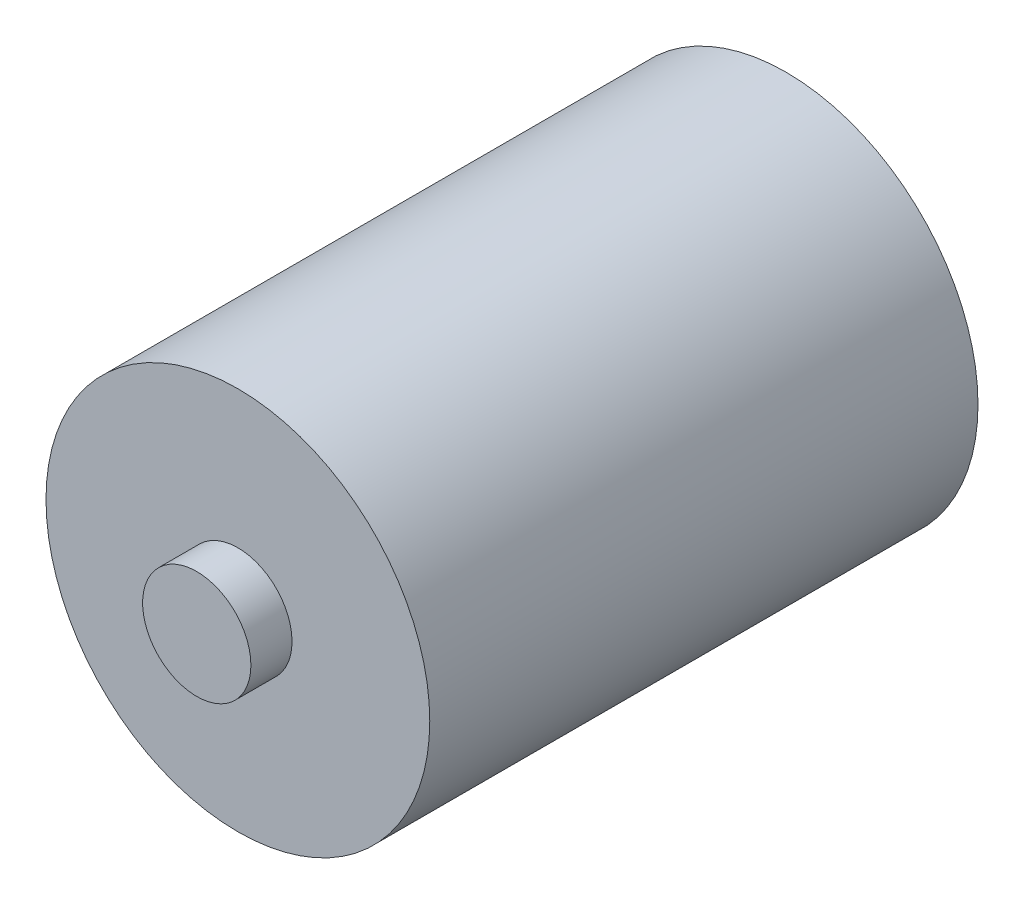
ISO-10303-21;
HEADER;
FILE_DESCRIPTION(('STEP AP214'),'2;1');
FILE_NAME('part.step','',(''),(''),'','','');
FILE_SCHEMA(('AUTOMOTIVE_DESIGN { 1 0 10303 214 1 1 1 1 }'));
ENDSEC;
DATA;
#1=APPLICATION_CONTEXT('core data for automotive mechanical design processes');
#2=APPLICATION_PROTOCOL_DEFINITION('international standard','automotive_design',2000,#1);
#3=PRODUCT_CONTEXT('',#1,'mechanical');
#4=PRODUCT('Part','Part','',(#3));
#5=PRODUCT_RELATED_PRODUCT_CATEGORY('part','',(#4));
#6=PRODUCT_DEFINITION_FORMATION('','',#4);
#7=PRODUCT_DEFINITION_CONTEXT('part definition',#1,'design');
#8=PRODUCT_DEFINITION('design','',#6,#7);
#9=PRODUCT_DEFINITION_SHAPE('','',#8);
#10=(LENGTH_UNIT() NAMED_UNIT(*) SI_UNIT(.MILLI.,.METRE.));
#11=(NAMED_UNIT(*) PLANE_ANGLE_UNIT() SI_UNIT($,.RADIAN.));
#12=(NAMED_UNIT(*) SI_UNIT($,.STERADIAN.) SOLID_ANGLE_UNIT());
#13=UNCERTAINTY_MEASURE_WITH_UNIT(LENGTH_MEASURE(1.E-05),#10,'distance_accuracy_value','');
#14=(GEOMETRIC_REPRESENTATION_CONTEXT(3) GLOBAL_UNCERTAINTY_ASSIGNED_CONTEXT((#13)) GLOBAL_UNIT_ASSIGNED_CONTEXT((#10,
#11,#12)) REPRESENTATION_CONTEXT('',''));
#15=CARTESIAN_POINT('',(0.,0.,0.));
#16=DIRECTION('',(0.,0.,1.));
#17=DIRECTION('',(1.,0.,0.));
#18=AXIS2_PLACEMENT_3D('',#15,#16,#17);
#19=CARTESIAN_POINT('',(0.,0.,-7.));
#20=DIRECTION('',(0.,0.,-1.));
#21=DIRECTION('',(-1.,0.,0.));
#22=AXIS2_PLACEMENT_3D('',#19,#20,#21);
#23=PLANE('',#22);
#24=CARTESIAN_POINT('',(-8.33710130089571,8.58016845602094,-7.));
#25=DIRECTION('',(0.,0.,-1.));
#26=DIRECTION('',(-1.,0.,0.));
#27=AXIS2_PLACEMENT_3D('',#24,#25,#26);
#28=CIRCLE('',#27,13.0059453973171);
#29=CARTESIAN_POINT('',(-21.3430466982128,8.58016845602094,-7.));
#30=VERTEX_POINT('',#29);
#31=EDGE_CURVE('E58',#30,#30,#28,.T.);
#32=ORIENTED_EDGE('',*,*,#31,.F.);
#33=EDGE_LOOP('',(#32));
#34=FACE_BOUND('',#33,.T.);
#35=CARTESIAN_POINT('',(0.,0.,-7.));
#36=DIRECTION('',(0.,0.,-1.));
#37=DIRECTION('',(-1.,0.,0.));
#38=AXIS2_PLACEMENT_3D('',#35,#36,#37);
#39=CIRCLE('',#38,31.5);
#40=CARTESIAN_POINT('',(-31.5,0.,-7.));
#41=VERTEX_POINT('',#40);
#42=EDGE_CURVE('E52',#41,#41,#39,.T.);
#43=ORIENTED_EDGE('',*,*,#42,.T.);
#44=EDGE_LOOP('',(#43));
#45=FACE_BOUND('',#44,.T.);
#46=CARTESIAN_POINT('',(13.6579561272328,-10.6157126716084,-7.));
#47=DIRECTION('',(0.,0.,-1.));
#48=DIRECTION('',(-1.,0.,0.));
#49=AXIS2_PLACEMENT_3D('',#46,#47,#48);
#50=CIRCLE('',#49,5.91310346280732);
#51=CARTESIAN_POINT('',(7.74485266442543,-10.6157126716084,-7.));
#52=VERTEX_POINT('',#51);
#53=EDGE_CURVE('E64',#52,#52,#50,.T.);
#54=ORIENTED_EDGE('',*,*,#53,.F.);
#55=EDGE_LOOP('',(#54));
#56=FACE_BOUND('',#55,.T.);
#57=ADVANCED_FACE('F31',(#34,#45,#56),#23,.T.);
#58=CARTESIAN_POINT('',(0.,0.,0.));
#59=DIRECTION('',(0.,0.,1.));
#60=DIRECTION('',(1.,0.,0.));
#61=AXIS2_PLACEMENT_3D('',#58,#59,#60);
#62=PLANE('',#61);
#63=CARTESIAN_POINT('',(0.,0.,0.));
#64=DIRECTION('',(0.,0.,1.));
#65=DIRECTION('',(1.,0.,0.));
#66=AXIS2_PLACEMENT_3D('',#63,#64,#65);
#67=CIRCLE('',#66,70.);
#68=CARTESIAN_POINT('',(70.,0.,0.));
#69=VERTEX_POINT('',#68);
#70=EDGE_CURVE('E42',#69,#69,#67,.T.);
#71=ORIENTED_EDGE('',*,*,#70,.F.);
#72=EDGE_LOOP('',(#71));
#73=FACE_BOUND('',#72,.T.);
#74=CARTESIAN_POINT('',(0.,0.,0.));
#75=DIRECTION('',(0.,0.,1.));
#76=DIRECTION('',(1.,0.,0.));
#77=AXIS2_PLACEMENT_3D('',#74,#75,#76);
#78=CIRCLE('',#77,31.5);
#79=CARTESIAN_POINT('',(31.5,0.,0.));
#80=VERTEX_POINT('',#79);
#81=EDGE_CURVE('E10',#80,#80,#78,.F.);
#82=ORIENTED_EDGE('',*,*,#81,.F.);
#83=EDGE_LOOP('',(#82));
#84=FACE_BOUND('',#83,.T.);
#85=ADVANCED_FACE('F80',(#73,#84),#62,.F.);
#86=CARTESIAN_POINT('',(0.,0.,200.));
#87=DIRECTION('',(0.,0.,1.));
#88=DIRECTION('',(1.,0.,0.));
#89=AXIS2_PLACEMENT_3D('',#86,#87,#88);
#90=PLANE('',#89);
#91=CARTESIAN_POINT('',(0.,0.,200.));
#92=DIRECTION('',(0.,0.,1.));
#93=DIRECTION('',(1.,0.,0.));
#94=AXIS2_PLACEMENT_3D('',#91,#92,#93);
#95=CIRCLE('',#94,70.);
#96=CARTESIAN_POINT('',(70.,0.,200.));
#97=VERTEX_POINT('',#96);
#98=EDGE_CURVE('E38',#97,#97,#95,.T.);
#99=ORIENTED_EDGE('',*,*,#98,.T.);
#100=EDGE_LOOP('',(#99));
#101=FACE_BOUND('',#100,.T.);
#102=CARTESIAN_POINT('',(0.,0.,200.));
#103=DIRECTION('',(0.,0.,1.));
#104=DIRECTION('',(1.,0.,0.));
#105=AXIS2_PLACEMENT_3D('',#102,#103,#104);
#106=CIRCLE('',#105,19.75);
#107=CARTESIAN_POINT('',(19.75,0.,200.));
#108=VERTEX_POINT('',#107);
#109=EDGE_CURVE('E49',#108,#108,#106,.T.);
#110=ORIENTED_EDGE('',*,*,#109,.F.);
#111=EDGE_LOOP('',(#110));
#112=FACE_BOUND('',#111,.T.);
#113=ADVANCED_FACE('F86',(#101,#112),#90,.T.);
#114=CARTESIAN_POINT('',(0.,0.,200.));
#115=DIRECTION('',(0.,0.,-1.));
#116=DIRECTION('',(-1.,0.,0.));
#117=AXIS2_PLACEMENT_3D('',#114,#115,#116);
#118=CYLINDRICAL_SURFACE('',#117,70.);
#119=ORIENTED_EDGE('',*,*,#98,.F.);
#120=EDGE_LOOP('',(#119));
#121=FACE_BOUND('',#120,.T.);
#122=ORIENTED_EDGE('',*,*,#70,.T.);
#123=EDGE_LOOP('',(#122));
#124=FACE_BOUND('',#123,.T.);
#125=ADVANCED_FACE('F33',(#121,#124),#118,.T.);
#126=CARTESIAN_POINT('',(0.,0.,215.));
#127=DIRECTION('',(0.,0.,-1.));
#128=DIRECTION('',(-1.,0.,0.));
#129=AXIS2_PLACEMENT_3D('',#126,#127,#128);
#130=CYLINDRICAL_SURFACE('',#129,19.75);
#131=CARTESIAN_POINT('',(0.,0.,215.));
#132=DIRECTION('',(0.,0.,1.));
#133=DIRECTION('',(1.,0.,0.));
#134=AXIS2_PLACEMENT_3D('',#131,#132,#133);
#135=CIRCLE('',#134,19.75);
#136=CARTESIAN_POINT('',(19.75,0.,215.));
#137=VERTEX_POINT('',#136);
#138=EDGE_CURVE('E47',#137,#137,#135,.T.);
#139=ORIENTED_EDGE('',*,*,#138,.F.);
#140=EDGE_LOOP('',(#139));
#141=FACE_BOUND('',#140,.T.);
#142=ORIENTED_EDGE('',*,*,#109,.T.);
#143=EDGE_LOOP('',(#142));
#144=FACE_BOUND('',#143,.T.);
#145=ADVANCED_FACE('F101',(#141,#144),#130,.T.);
#146=CARTESIAN_POINT('',(0.,0.,215.));
#147=DIRECTION('',(0.,0.,1.));
#148=DIRECTION('',(1.,0.,0.));
#149=AXIS2_PLACEMENT_3D('',#146,#147,#148);
#150=PLANE('',#149);
#151=ORIENTED_EDGE('',*,*,#138,.T.);
#152=EDGE_LOOP('',(#151));
#153=FACE_BOUND('',#152,.T.);
#154=ADVANCED_FACE('F97',(#153),#150,.T.);
#155=CARTESIAN_POINT('',(0.,0.,-7.));
#156=DIRECTION('',(0.,0.,1.));
#157=DIRECTION('',(1.,0.,0.));
#158=AXIS2_PLACEMENT_3D('',#155,#156,#157);
#159=CYLINDRICAL_SURFACE('',#158,31.5);
#160=ORIENTED_EDGE('',*,*,#42,.F.);
#161=EDGE_LOOP('',(#160));
#162=FACE_BOUND('',#161,.T.);
#163=ORIENTED_EDGE('',*,*,#81,.T.);
#164=EDGE_LOOP('',(#163));
#165=FACE_BOUND('',#164,.T.);
#166=ADVANCED_FACE('F94',(#162,#165),#159,.T.);
#167=CARTESIAN_POINT('',(-8.33710130089571,8.58016845602094,-17.));
#168=DIRECTION('',(0.,0.,1.));
#169=DIRECTION('',(1.,0.,0.));
#170=AXIS2_PLACEMENT_3D('',#167,#168,#169);
#171=CYLINDRICAL_SURFACE('',#170,13.0059453973171);
#172=CARTESIAN_POINT('',(-8.33710130089571,8.58016845602094,-17.));
#173=DIRECTION('',(0.,0.,-1.));
#174=DIRECTION('',(-1.,0.,0.));
#175=AXIS2_PLACEMENT_3D('',#172,#173,#174);
#176=CIRCLE('',#175,13.0059453973171);
#177=CARTESIAN_POINT('',(-21.3430466982128,8.58016845602094,-17.));
#178=VERTEX_POINT('',#177);
#179=EDGE_CURVE('E57',#178,#178,#176,.T.);
#180=ORIENTED_EDGE('',*,*,#179,.F.);
#181=EDGE_LOOP('',(#180));
#182=FACE_BOUND('',#181,.T.);
#183=ORIENTED_EDGE('',*,*,#31,.T.);
#184=EDGE_LOOP('',(#183));
#185=FACE_BOUND('',#184,.T.);
#186=ADVANCED_FACE('F92',(#182,#185),#171,.T.);
#187=CARTESIAN_POINT('',(-8.33710130089571,8.58016845602094,-17.));
#188=DIRECTION('',(0.,0.,-1.));
#189=DIRECTION('',(-1.,0.,0.));
#190=AXIS2_PLACEMENT_3D('',#187,#188,#189);
#191=PLANE('',#190);
#192=ORIENTED_EDGE('',*,*,#179,.T.);
#193=EDGE_LOOP('',(#192));
#194=FACE_BOUND('',#193,.T.);
#195=ADVANCED_FACE('F75',(#194),#191,.T.);
#196=CARTESIAN_POINT('',(13.6579561272328,-10.6157126716084,-17.));
#197=DIRECTION('',(0.,0.,1.));
#198=DIRECTION('',(1.,0.,0.));
#199=AXIS2_PLACEMENT_3D('',#196,#197,#198);
#200=CYLINDRICAL_SURFACE('',#199,5.91310346280732);
#201=CARTESIAN_POINT('',(13.6579561272328,-10.6157126716084,-17.));
#202=DIRECTION('',(0.,0.,-1.));
#203=DIRECTION('',(-1.,0.,0.));
#204=AXIS2_PLACEMENT_3D('',#201,#202,#203);
#205=CIRCLE('',#204,5.91310346280732);
#206=CARTESIAN_POINT('',(7.74485266442543,-10.6157126716084,-17.));
#207=VERTEX_POINT('',#206);
#208=EDGE_CURVE('E61',#207,#207,#205,.T.);
#209=ORIENTED_EDGE('',*,*,#208,.F.);
#210=EDGE_LOOP('',(#209));
#211=FACE_BOUND('',#210,.T.);
#212=ORIENTED_EDGE('',*,*,#53,.T.);
#213=EDGE_LOOP('',(#212));
#214=FACE_BOUND('',#213,.T.);
#215=ADVANCED_FACE('F72',(#211,#214),#200,.T.);
#216=CARTESIAN_POINT('',(13.6579561272328,-10.6157126716084,-17.));
#217=DIRECTION('',(0.,0.,-1.));
#218=DIRECTION('',(-1.,0.,0.));
#219=AXIS2_PLACEMENT_3D('',#216,#217,#218);
#220=PLANE('',#219);
#221=ORIENTED_EDGE('',*,*,#208,.T.);
#222=EDGE_LOOP('',(#221));
#223=FACE_BOUND('',#222,.T.);
#224=ADVANCED_FACE('F70',(#223),#220,.T.);
#225=CLOSED_SHELL('',(#57,#85,#113,#125,#145,#154,#166,#186,#195,#215,#224));
#226=MANIFOLD_SOLID_BREP('B2',#225);
#227=ADVANCED_BREP_SHAPE_REPRESENTATION('',(#18,#226),#14);
#228=SHAPE_DEFINITION_REPRESENTATION(#9,#227);
ENDSEC;
END-ISO-10303-21;
